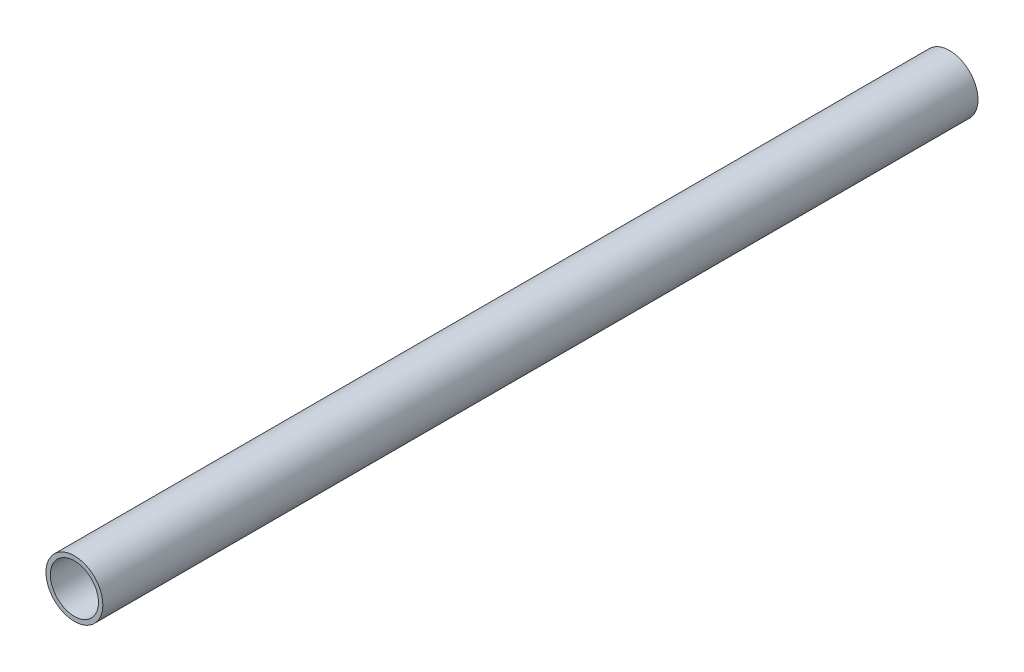
ISO-10303-21;
HEADER;
FILE_DESCRIPTION(('STEP AP214'),'2;1');
FILE_NAME('part.step','',(''),(''),'','','');
FILE_SCHEMA(('AUTOMOTIVE_DESIGN { 1 0 10303 214 1 1 1 1 }'));
ENDSEC;
DATA;
#1=APPLICATION_CONTEXT('core data for automotive mechanical design processes');
#2=APPLICATION_PROTOCOL_DEFINITION('international standard','automotive_design',2000,#1);
#3=PRODUCT_CONTEXT('',#1,'mechanical');
#4=PRODUCT('Part','Part','',(#3));
#5=PRODUCT_RELATED_PRODUCT_CATEGORY('part','',(#4));
#6=PRODUCT_DEFINITION_FORMATION('','',#4);
#7=PRODUCT_DEFINITION_CONTEXT('part definition',#1,'design');
#8=PRODUCT_DEFINITION('design','',#6,#7);
#9=PRODUCT_DEFINITION_SHAPE('','',#8);
#10=(LENGTH_UNIT() NAMED_UNIT(*) SI_UNIT(.MILLI.,.METRE.));
#11=(NAMED_UNIT(*) PLANE_ANGLE_UNIT() SI_UNIT($,.RADIAN.));
#12=(NAMED_UNIT(*) SI_UNIT($,.STERADIAN.) SOLID_ANGLE_UNIT());
#13=UNCERTAINTY_MEASURE_WITH_UNIT(LENGTH_MEASURE(1.E-05),#10,'distance_accuracy_value','');
#14=(GEOMETRIC_REPRESENTATION_CONTEXT(3) GLOBAL_UNCERTAINTY_ASSIGNED_CONTEXT((#13)) GLOBAL_UNIT_ASSIGNED_CONTEXT((#10,
#11,#12)) REPRESENTATION_CONTEXT('',''));
#15=CARTESIAN_POINT('',(0.,0.,0.));
#16=DIRECTION('',(0.,0.,1.));
#17=DIRECTION('',(1.,0.,0.));
#18=AXIS2_PLACEMENT_3D('',#15,#16,#17);
#19=CARTESIAN_POINT('',(0.,0.,200.));
#20=DIRECTION('',(0.,0.,1.));
#21=DIRECTION('',(1.,0.,0.));
#22=AXIS2_PLACEMENT_3D('',#19,#20,#21);
#23=PLANE('',#22);
#24=CARTESIAN_POINT('',(0.,0.,200.));
#25=DIRECTION('',(0.,0.,1.));
#26=DIRECTION('',(1.,0.,0.));
#27=AXIS2_PLACEMENT_3D('',#24,#25,#26);
#28=CIRCLE('',#27,6.5);
#29=CARTESIAN_POINT('',(6.5,0.,200.));
#30=VERTEX_POINT('',#29);
#31=EDGE_CURVE('E10',#30,#30,#28,.T.);
#32=ORIENTED_EDGE('',*,*,#31,.T.);
#33=EDGE_LOOP('',(#32));
#34=FACE_BOUND('',#33,.T.);
#35=CARTESIAN_POINT('',(0.,0.,200.));
#36=DIRECTION('',(0.,0.,1.));
#37=DIRECTION('',(1.,0.,0.));
#38=AXIS2_PLACEMENT_3D('',#35,#36,#37);
#39=CIRCLE('',#38,5.5);
#40=CARTESIAN_POINT('',(5.5,0.,200.));
#41=VERTEX_POINT('',#40);
#42=EDGE_CURVE('E48',#41,#41,#39,.T.);
#43=ORIENTED_EDGE('',*,*,#42,.F.);
#44=EDGE_LOOP('',(#43));
#45=FACE_BOUND('',#44,.T.);
#46=ADVANCED_FACE('F37',(#34,#45),#23,.T.);
#47=CARTESIAN_POINT('',(0.,0.,0.));
#48=DIRECTION('',(0.,0.,1.));
#49=DIRECTION('',(1.,0.,0.));
#50=AXIS2_PLACEMENT_3D('',#47,#48,#49);
#51=PLANE('',#50);
#52=CARTESIAN_POINT('',(0.,0.,0.));
#53=DIRECTION('',(0.,0.,1.));
#54=DIRECTION('',(1.,0.,0.));
#55=AXIS2_PLACEMENT_3D('',#52,#53,#54);
#56=CIRCLE('',#55,6.5);
#57=CARTESIAN_POINT('',(6.5,0.,0.));
#58=VERTEX_POINT('',#57);
#59=EDGE_CURVE('E41',#58,#58,#56,.T.);
#60=ORIENTED_EDGE('',*,*,#59,.F.);
#61=EDGE_LOOP('',(#60));
#62=FACE_BOUND('',#61,.T.);
#63=CARTESIAN_POINT('',(0.,0.,0.));
#64=DIRECTION('',(0.,0.,1.));
#65=DIRECTION('',(1.,0.,0.));
#66=AXIS2_PLACEMENT_3D('',#63,#64,#65);
#67=CIRCLE('',#66,5.5);
#68=CARTESIAN_POINT('',(5.5,0.,0.));
#69=VERTEX_POINT('',#68);
#70=EDGE_CURVE('E50',#69,#69,#67,.T.);
#71=ORIENTED_EDGE('',*,*,#70,.T.);
#72=EDGE_LOOP('',(#71));
#73=FACE_BOUND('',#72,.T.);
#74=ADVANCED_FACE('F60',(#62,#73),#51,.F.);
#75=CARTESIAN_POINT('',(0.,0.,200.));
#76=DIRECTION('',(0.,0.,-1.));
#77=DIRECTION('',(-1.,0.,0.));
#78=AXIS2_PLACEMENT_3D('',#75,#76,#77);
#79=CYLINDRICAL_SURFACE('',#78,6.5);
#80=ORIENTED_EDGE('',*,*,#31,.F.);
#81=EDGE_LOOP('',(#80));
#82=FACE_BOUND('',#81,.T.);
#83=ORIENTED_EDGE('',*,*,#59,.T.);
#84=EDGE_LOOP('',(#83));
#85=FACE_BOUND('',#84,.T.);
#86=ADVANCED_FACE('F39',(#82,#85),#79,.T.);
#87=CARTESIAN_POINT('',(0.,0.,200.));
#88=DIRECTION('',(0.,0.,-1.));
#89=DIRECTION('',(-1.,0.,0.));
#90=AXIS2_PLACEMENT_3D('',#87,#88,#89);
#91=CYLINDRICAL_SURFACE('',#90,5.5);
#92=ORIENTED_EDGE('',*,*,#42,.T.);
#93=EDGE_LOOP('',(#92));
#94=FACE_BOUND('',#93,.T.);
#95=ORIENTED_EDGE('',*,*,#70,.F.);
#96=EDGE_LOOP('',(#95));
#97=FACE_BOUND('',#96,.T.);
#98=ADVANCED_FACE('F56',(#94,#97),#91,.F.);
#99=CLOSED_SHELL('',(#46,#74,#86,#98));
#100=MANIFOLD_SOLID_BREP('B2',#99);
#101=ADVANCED_BREP_SHAPE_REPRESENTATION('',(#18,#100),#14);
#102=SHAPE_DEFINITION_REPRESENTATION(#9,#101);
ENDSEC;
END-ISO-10303-21;
